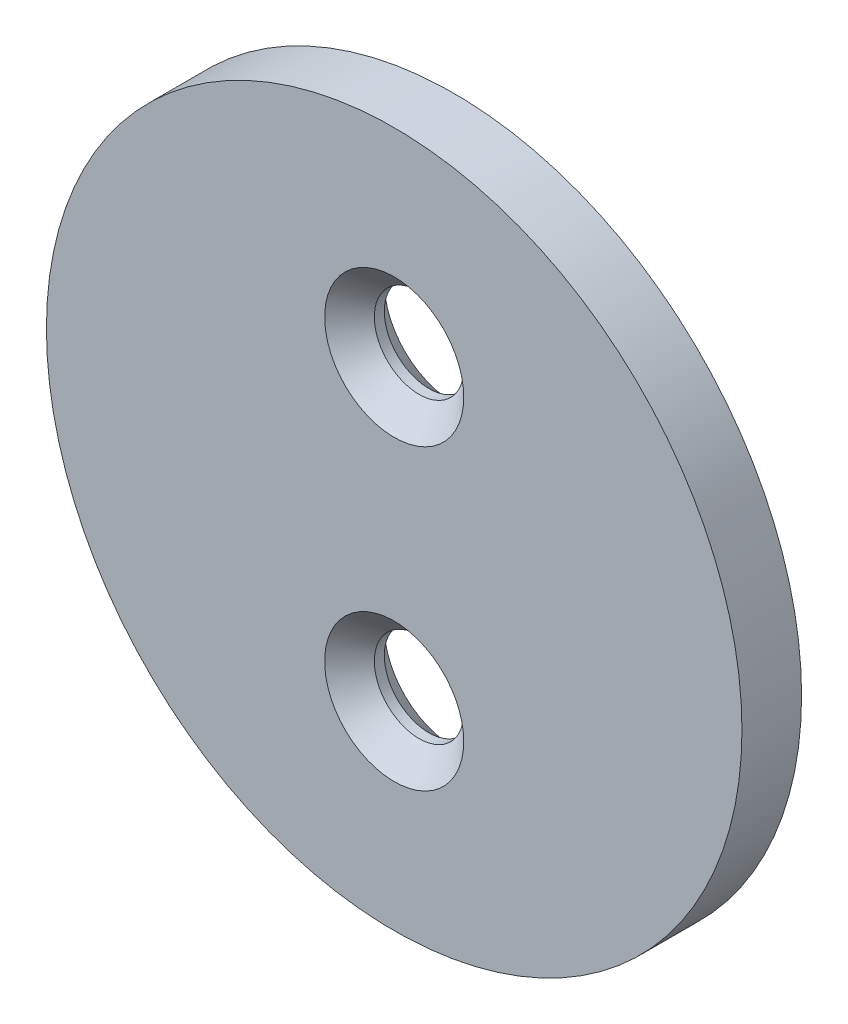
ISO-10303-21;
HEADER;
FILE_DESCRIPTION(('STEP AP214'),'2;1');
FILE_NAME('part.step','',(''),(''),'','','');
FILE_SCHEMA(('AUTOMOTIVE_DESIGN { 1 0 10303 214 1 1 1 1 }'));
ENDSEC;
DATA;
#1=APPLICATION_CONTEXT('core data for automotive mechanical design processes');
#2=APPLICATION_PROTOCOL_DEFINITION('international standard','automotive_design',2000,#1);
#3=PRODUCT_CONTEXT('',#1,'mechanical');
#4=PRODUCT('Part','Part','',(#3));
#5=PRODUCT_RELATED_PRODUCT_CATEGORY('part','',(#4));
#6=PRODUCT_DEFINITION_FORMATION('','',#4);
#7=PRODUCT_DEFINITION_CONTEXT('part definition',#1,'design');
#8=PRODUCT_DEFINITION('design','',#6,#7);
#9=PRODUCT_DEFINITION_SHAPE('','',#8);
#10=(LENGTH_UNIT() NAMED_UNIT(*) SI_UNIT(.MILLI.,.METRE.));
#11=(NAMED_UNIT(*) PLANE_ANGLE_UNIT() SI_UNIT($,.RADIAN.));
#12=(NAMED_UNIT(*) SI_UNIT($,.STERADIAN.) SOLID_ANGLE_UNIT());
#13=UNCERTAINTY_MEASURE_WITH_UNIT(LENGTH_MEASURE(1.E-05),#10,'distance_accuracy_value','');
#14=(GEOMETRIC_REPRESENTATION_CONTEXT(3) GLOBAL_UNCERTAINTY_ASSIGNED_CONTEXT((#13)) GLOBAL_UNIT_ASSIGNED_CONTEXT((#10,
#11,#12)) REPRESENTATION_CONTEXT('',''));
#15=CARTESIAN_POINT('',(0.,0.,0.));
#16=DIRECTION('',(0.,0.,1.));
#17=DIRECTION('',(1.,0.,0.));
#18=AXIS2_PLACEMENT_3D('',#15,#16,#17);
#19=CARTESIAN_POINT('',(0.,0.,1.2));
#20=DIRECTION('',(0.,0.,-1.));
#21=DIRECTION('',(-1.,0.,0.));
#22=AXIS2_PLACEMENT_3D('',#19,#20,#21);
#23=CYLINDRICAL_SURFACE('',#22,7.);
#24=CARTESIAN_POINT('',(0.,0.,1.2));
#25=DIRECTION('',(0.,0.,1.));
#26=DIRECTION('',(1.,0.,0.));
#27=AXIS2_PLACEMENT_3D('',#24,#25,#26);
#28=CIRCLE('',#27,7.);
#29=CARTESIAN_POINT('',(7.,0.,1.2));
#30=VERTEX_POINT('',#29);
#31=EDGE_CURVE('E76',#30,#30,#28,.T.);
#32=ORIENTED_EDGE('',*,*,#31,.F.);
#33=EDGE_LOOP('',(#32));
#34=FACE_BOUND('',#33,.T.);
#35=CARTESIAN_POINT('',(0.,0.,0.));
#36=DIRECTION('',(0.,0.,1.));
#37=DIRECTION('',(1.,0.,0.));
#38=AXIS2_PLACEMENT_3D('',#35,#36,#37);
#39=CIRCLE('',#38,7.);
#40=CARTESIAN_POINT('',(7.,0.,0.));
#41=VERTEX_POINT('',#40);
#42=EDGE_CURVE('E77',#41,#41,#39,.T.);
#43=ORIENTED_EDGE('',*,*,#42,.T.);
#44=EDGE_LOOP('',(#43));
#45=FACE_BOUND('',#44,.T.);
#46=ADVANCED_FACE('F43',(#34,#45),#23,.T.);
#47=CARTESIAN_POINT('',(0.,0.,1.2));
#48=DIRECTION('',(0.,0.,1.));
#49=DIRECTION('',(1.,0.,0.));
#50=AXIS2_PLACEMENT_3D('',#47,#48,#49);
#51=PLANE('',#50);
#52=CARTESIAN_POINT('',(0.,-3.,1.2));
#53=DIRECTION('',(0.,0.,1.));
#54=DIRECTION('',(1.,0.,0.));
#55=AXIS2_PLACEMENT_3D('',#52,#53,#54);
#56=CIRCLE('',#55,1.4);
#57=CARTESIAN_POINT('',(1.4,-3.,1.2));
#58=VERTEX_POINT('',#57);
#59=EDGE_CURVE('E12',#58,#58,#56,.F.);
#60=ORIENTED_EDGE('',*,*,#59,.T.);
#61=EDGE_LOOP('',(#60));
#62=FACE_BOUND('',#61,.T.);
#63=CARTESIAN_POINT('',(0.,3.,1.2));
#64=DIRECTION('',(0.,0.,1.));
#65=DIRECTION('',(1.,0.,0.));
#66=AXIS2_PLACEMENT_3D('',#63,#64,#65);
#67=CIRCLE('',#66,1.4);
#68=CARTESIAN_POINT('',(1.4,3.,1.2));
#69=VERTEX_POINT('',#68);
#70=EDGE_CURVE('E51',#69,#69,#67,.F.);
#71=ORIENTED_EDGE('',*,*,#70,.T.);
#72=EDGE_LOOP('',(#71));
#73=FACE_BOUND('',#72,.T.);
#74=ORIENTED_EDGE('',*,*,#31,.T.);
#75=EDGE_LOOP('',(#74));
#76=FACE_BOUND('',#75,.T.);
#77=ADVANCED_FACE('F83',(#62,#73,#76),#51,.T.);
#78=CARTESIAN_POINT('',(0.,0.,0.));
#79=DIRECTION('',(0.,0.,1.));
#80=DIRECTION('',(1.,0.,0.));
#81=AXIS2_PLACEMENT_3D('',#78,#79,#80);
#82=PLANE('',#81);
#83=CARTESIAN_POINT('',(0.,3.,0.));
#84=DIRECTION('',(0.,0.,1.));
#85=DIRECTION('',(1.,0.,0.));
#86=AXIS2_PLACEMENT_3D('',#83,#84,#85);
#87=CIRCLE('',#86,1.4);
#88=CARTESIAN_POINT('',(1.4,3.,0.));
#89=VERTEX_POINT('',#88);
#90=EDGE_CURVE('E70',#89,#89,#87,.T.);
#91=ORIENTED_EDGE('',*,*,#90,.T.);
#92=EDGE_LOOP('',(#91));
#93=FACE_BOUND('',#92,.T.);
#94=CARTESIAN_POINT('',(0.,-3.,0.));
#95=DIRECTION('',(0.,0.,1.));
#96=DIRECTION('',(1.,0.,0.));
#97=AXIS2_PLACEMENT_3D('',#94,#95,#96);
#98=CIRCLE('',#97,1.4);
#99=CARTESIAN_POINT('',(1.4,-3.,0.));
#100=VERTEX_POINT('',#99);
#101=EDGE_CURVE('E73',#100,#100,#98,.T.);
#102=ORIENTED_EDGE('',*,*,#101,.T.);
#103=EDGE_LOOP('',(#102));
#104=FACE_BOUND('',#103,.T.);
#105=ORIENTED_EDGE('',*,*,#42,.F.);
#106=EDGE_LOOP('',(#105));
#107=FACE_BOUND('',#106,.T.);
#108=ADVANCED_FACE('F90',(#93,#104,#107),#82,.F.);
#109=CARTESIAN_POINT('',(0.,-3.,0.));
#110=DIRECTION('',(0.,0.,1.));
#111=DIRECTION('',(1.,0.,0.));
#112=AXIS2_PLACEMENT_3D('',#109,#110,#111);
#113=CYLINDRICAL_SURFACE('',#112,0.9);
#114=CARTESIAN_POINT('',(0.,-3.,0.5));
#115=DIRECTION('',(0.,0.,1.));
#116=DIRECTION('',(1.,0.,0.));
#117=AXIS2_PLACEMENT_3D('',#114,#115,#116);
#118=CIRCLE('',#117,0.9);
#119=CARTESIAN_POINT('',(0.9,-3.,0.5));
#120=VERTEX_POINT('',#119);
#121=EDGE_CURVE('E55',#120,#120,#118,.F.);
#122=ORIENTED_EDGE('',*,*,#121,.T.);
#123=EDGE_LOOP('',(#122));
#124=FACE_BOUND('',#123,.T.);
#125=CARTESIAN_POINT('',(0.,-3.,0.7));
#126=DIRECTION('',(0.,0.,1.));
#127=DIRECTION('',(1.,0.,0.));
#128=AXIS2_PLACEMENT_3D('',#125,#126,#127);
#129=CIRCLE('',#128,0.9);
#130=CARTESIAN_POINT('',(0.9,-3.,0.7));
#131=VERTEX_POINT('',#130);
#132=EDGE_CURVE('E59',#131,#131,#129,.T.);
#133=ORIENTED_EDGE('',*,*,#132,.T.);
#134=EDGE_LOOP('',(#133));
#135=FACE_BOUND('',#134,.T.);
#136=ADVANCED_FACE('F92',(#124,#135),#113,.F.);
#137=CARTESIAN_POINT('',(0.,3.,0.));
#138=DIRECTION('',(0.,0.,1.));
#139=DIRECTION('',(1.,0.,0.));
#140=AXIS2_PLACEMENT_3D('',#137,#138,#139);
#141=CYLINDRICAL_SURFACE('',#140,0.9);
#142=CARTESIAN_POINT('',(0.,3.,0.5));
#143=DIRECTION('',(0.,0.,1.));
#144=DIRECTION('',(1.,0.,0.));
#145=AXIS2_PLACEMENT_3D('',#142,#143,#144);
#146=CIRCLE('',#145,0.9);
#147=CARTESIAN_POINT('',(0.9,3.,0.5));
#148=VERTEX_POINT('',#147);
#149=EDGE_CURVE('E64',#148,#148,#146,.F.);
#150=ORIENTED_EDGE('',*,*,#149,.T.);
#151=EDGE_LOOP('',(#150));
#152=FACE_BOUND('',#151,.T.);
#153=CARTESIAN_POINT('',(0.,3.,0.7));
#154=DIRECTION('',(0.,0.,1.));
#155=DIRECTION('',(1.,0.,0.));
#156=AXIS2_PLACEMENT_3D('',#153,#154,#155);
#157=CIRCLE('',#156,0.9);
#158=CARTESIAN_POINT('',(0.9,3.,0.7));
#159=VERTEX_POINT('',#158);
#160=EDGE_CURVE('E67',#159,#159,#157,.T.);
#161=ORIENTED_EDGE('',*,*,#160,.T.);
#162=EDGE_LOOP('',(#161));
#163=FACE_BOUND('',#162,.T.);
#164=ADVANCED_FACE('F99',(#152,#163),#141,.F.);
#165=CARTESIAN_POINT('',(0.,3.,0.));
#166=DIRECTION('',(0.,0.,-1.));
#167=DIRECTION('',(-1.,0.,0.));
#168=AXIS2_PLACEMENT_3D('',#165,#166,#167);
#169=CONICAL_SURFACE('',#168,1.4,0.785398163397448);
#170=ORIENTED_EDGE('',*,*,#149,.F.);
#171=EDGE_LOOP('',(#170));
#172=FACE_BOUND('',#171,.T.);
#173=ORIENTED_EDGE('',*,*,#90,.F.);
#174=EDGE_LOOP('',(#173));
#175=FACE_BOUND('',#174,.T.);
#176=ADVANCED_FACE('F106',(#172,#175),#169,.F.);
#177=CARTESIAN_POINT('',(0.,-3.,0.));
#178=DIRECTION('',(0.,0.,-1.));
#179=DIRECTION('',(-1.,0.,0.));
#180=AXIS2_PLACEMENT_3D('',#177,#178,#179);
#181=CONICAL_SURFACE('',#180,1.4,0.785398163397448);
#182=ORIENTED_EDGE('',*,*,#121,.F.);
#183=EDGE_LOOP('',(#182));
#184=FACE_BOUND('',#183,.T.);
#185=ORIENTED_EDGE('',*,*,#101,.F.);
#186=EDGE_LOOP('',(#185));
#187=FACE_BOUND('',#186,.T.);
#188=ADVANCED_FACE('F112',(#184,#187),#181,.F.);
#189=CARTESIAN_POINT('',(0.,-3.,0.7));
#190=DIRECTION('',(0.,0.,1.));
#191=DIRECTION('',(1.,0.,0.));
#192=AXIS2_PLACEMENT_3D('',#189,#190,#191);
#193=CONICAL_SURFACE('',#192,0.9,0.785398163397448);
#194=ORIENTED_EDGE('',*,*,#59,.F.);
#195=EDGE_LOOP('',(#194));
#196=FACE_BOUND('',#195,.T.);
#197=ORIENTED_EDGE('',*,*,#132,.F.);
#198=EDGE_LOOP('',(#197));
#199=FACE_BOUND('',#198,.T.);
#200=ADVANCED_FACE('F118',(#196,#199),#193,.F.);
#201=CARTESIAN_POINT('',(0.,3.,0.7));
#202=DIRECTION('',(0.,0.,1.));
#203=DIRECTION('',(1.,0.,0.));
#204=AXIS2_PLACEMENT_3D('',#201,#202,#203);
#205=CONICAL_SURFACE('',#204,0.9,0.785398163397448);
#206=ORIENTED_EDGE('',*,*,#70,.F.);
#207=EDGE_LOOP('',(#206));
#208=FACE_BOUND('',#207,.T.);
#209=ORIENTED_EDGE('',*,*,#160,.F.);
#210=EDGE_LOOP('',(#209));
#211=FACE_BOUND('',#210,.T.);
#212=ADVANCED_FACE('F46',(#208,#211),#205,.F.);
#213=CLOSED_SHELL('',(#46,#77,#108,#136,#164,#176,#188,#200,#212));
#214=MANIFOLD_SOLID_BREP('B2',#213);
#215=ADVANCED_BREP_SHAPE_REPRESENTATION('',(#18,#214),#14);
#216=SHAPE_DEFINITION_REPRESENTATION(#9,#215);
ENDSEC;
END-ISO-10303-21;
